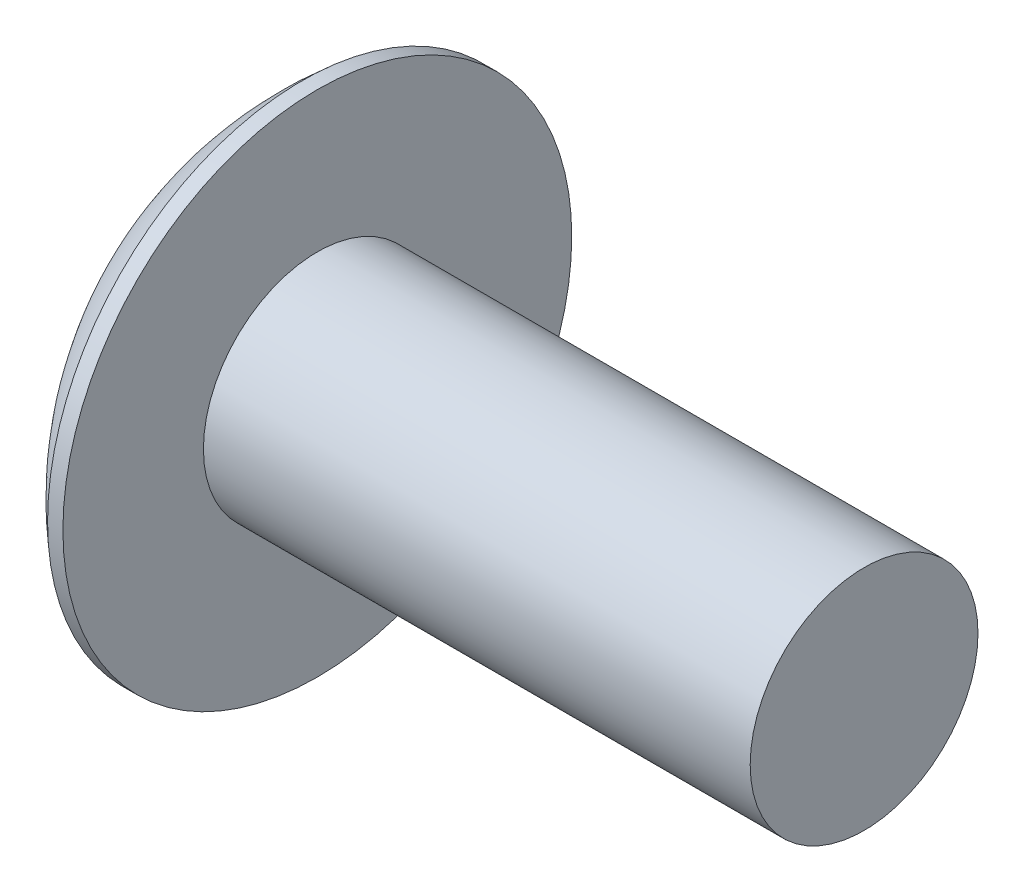
ISO-10303-21;
HEADER;
FILE_DESCRIPTION(('STEP AP214'),'2;1');
FILE_NAME('part.step','',(''),(''),'','','');
FILE_SCHEMA(('AUTOMOTIVE_DESIGN { 1 0 10303 214 1 1 1 1 }'));
ENDSEC;
DATA;
#1=APPLICATION_CONTEXT('core data for automotive mechanical design processes');
#2=APPLICATION_PROTOCOL_DEFINITION('international standard','automotive_design',2000,#1);
#3=PRODUCT_CONTEXT('',#1,'mechanical');
#4=PRODUCT('Part','Part','',(#3));
#5=PRODUCT_RELATED_PRODUCT_CATEGORY('part','',(#4));
#6=PRODUCT_DEFINITION_FORMATION('','',#4);
#7=PRODUCT_DEFINITION_CONTEXT('part definition',#1,'design');
#8=PRODUCT_DEFINITION('design','',#6,#7);
#9=PRODUCT_DEFINITION_SHAPE('','',#8);
#10=(LENGTH_UNIT() NAMED_UNIT(*) SI_UNIT(.MILLI.,.METRE.));
#11=(NAMED_UNIT(*) PLANE_ANGLE_UNIT() SI_UNIT($,.RADIAN.));
#12=(NAMED_UNIT(*) SI_UNIT($,.STERADIAN.) SOLID_ANGLE_UNIT());
#13=UNCERTAINTY_MEASURE_WITH_UNIT(LENGTH_MEASURE(1.E-05),#10,'distance_accuracy_value','');
#14=(GEOMETRIC_REPRESENTATION_CONTEXT(3) GLOBAL_UNCERTAINTY_ASSIGNED_CONTEXT((#13)) GLOBAL_UNIT_ASSIGNED_CONTEXT((#10,
#11,#12)) REPRESENTATION_CONTEXT('',''));
#15=CARTESIAN_POINT('',(0.,0.,0.));
#16=DIRECTION('',(0.,0.,1.));
#17=DIRECTION('',(1.,0.,0.));
#18=AXIS2_PLACEMENT_3D('',#15,#16,#17);
#19=CARTESIAN_POINT('',(11.6078,0.,0.));
#20=DIRECTION('',(-1.,0.,0.));
#21=DIRECTION('',(0.,1.,0.));
#22=AXIS2_PLACEMENT_3D('',#19,#20,#21);
#23=SPHERICAL_SURFACE('',#22,11.6078);
#24=CARTESIAN_POINT('',(4.11380989592327,0.,0.));
#25=DIRECTION('',(-1.,0.,0.));
#26=DIRECTION('',(0.,0.,1.));
#27=AXIS2_PLACEMENT_3D('',#24,#25,#26);
#28=CIRCLE('',#27,8.8646);
#29=CARTESIAN_POINT('',(4.11380989592327,0.,8.8646));
#30=VERTEX_POINT('',#29);
#31=EDGE_CURVE('E152',#30,#30,#28,.T.);
#32=ORIENTED_EDGE('',*,*,#31,.T.);
#33=EDGE_LOOP('',(#32));
#34=FACE_BOUND('',#33,.T.);
#35=CARTESIAN_POINT('',(11.6076636497244,-0.00185599181089486,0.));
#36=DIRECTION('',(-0.0732674626684288,-0.997312327665777,0.));
#37=DIRECTION('',(0.997312327665777,-0.0732674626684288,0.));
#38=AXIS2_PLACEMENT_3D('',#35,#36,#37);
#39=CIRCLE('',#38,11.6077998508203);
#40=CARTESIAN_POINT('',(0.853347013414177,0.788208936514514,4.29668342698341));
#41=VERTEX_POINT('',#40);
#42=CARTESIAN_POINT('',(0.0618747714753645,0.846354375341171,0.846354375341173));
#43=VERTEX_POINT('',#42);
#44=EDGE_CURVE('E180',#41,#43,#39,.T.);
#45=ORIENTED_EDGE('',*,*,#44,.F.);
#46=CARTESIAN_POINT('',(9.60018560309285,0.,-2.56076130067038));
#47=DIRECTION('',(0.616982786851214,0.,0.786976645606024));
#48=DIRECTION('',(0.786976645606024,0.,-0.616982786851214));
#49=AXIS2_PLACEMENT_3D('',#46,#47,#48);
#50=CIRCLE('',#49,11.1423968173064);
#51=CARTESIAN_POINT('',(0.853347013414177,-0.788208936514543,4.2966834269834));
#52=VERTEX_POINT('',#51);
#53=EDGE_CURVE('E148',#41,#52,#50,.T.);
#54=ORIENTED_EDGE('',*,*,#53,.T.);
#55=CARTESIAN_POINT('',(11.6076636497244,0.00185599181089376,0.));
#56=DIRECTION('',(-0.0732674626684286,0.997312327665777,0.));
#57=DIRECTION('',(-0.997312327665777,-0.0732674626684286,0.));
#58=AXIS2_PLACEMENT_3D('',#55,#56,#57);
#59=CIRCLE('',#58,11.6077998508203);
#60=CARTESIAN_POINT('',(0.0618747714753645,-0.846354375341176,0.846354375341173));
#61=VERTEX_POINT('',#60);
#62=EDGE_CURVE('E104',#61,#52,#59,.T.);
#63=ORIENTED_EDGE('',*,*,#62,.F.);
#64=CARTESIAN_POINT('',(11.6076636497244,0.,-0.00185599181089377));
#65=DIRECTION('',(-0.0732674626684286,0.,-0.997312327665777));
#66=DIRECTION('',(-0.997312327665777,0.,0.0732674626684286));
#67=AXIS2_PLACEMENT_3D('',#64,#65,#66);
#68=CIRCLE('',#67,11.6077998508203);
#69=CARTESIAN_POINT('',(0.853347013414175,-4.2966834269834,0.788208936514527));
#70=VERTEX_POINT('',#69);
#71=EDGE_CURVE('E129',#70,#61,#68,.T.);
#72=ORIENTED_EDGE('',*,*,#71,.F.);
#73=CARTESIAN_POINT('',(9.60018560309285,2.56076130067038,0.));
#74=DIRECTION('',(0.616982786851214,-0.786976645606024,0.));
#75=DIRECTION('',(0.786976645606024,0.616982786851214,0.));
#76=AXIS2_PLACEMENT_3D('',#73,#74,#75);
#77=CIRCLE('',#76,11.1423968173064);
#78=CARTESIAN_POINT('',(0.853347013414175,-4.2966834269834,-0.788208936514529));
#79=VERTEX_POINT('',#78);
#80=EDGE_CURVE('E137',#70,#79,#77,.T.);
#81=ORIENTED_EDGE('',*,*,#80,.T.);
#82=CARTESIAN_POINT('',(11.6076636497244,0.,0.00185599181089485));
#83=DIRECTION('',(-0.0732674626684288,0.,0.997312327665777));
#84=DIRECTION('',(0.997312327665777,0.,0.0732674626684288));
#85=AXIS2_PLACEMENT_3D('',#82,#83,#84);
#86=CIRCLE('',#85,11.6077998508203);
#87=CARTESIAN_POINT('',(0.0618747714753645,-0.84635437534117,-0.846354375341174));
#88=VERTEX_POINT('',#87);
#89=EDGE_CURVE('E47',#88,#79,#86,.T.);
#90=ORIENTED_EDGE('',*,*,#89,.F.);
#91=CARTESIAN_POINT('',(0.853347013414177,-0.788208936514512,-4.29668342698341));
#92=VERTEX_POINT('',#91);
#93=EDGE_CURVE('E187',#92,#88,#59,.T.);
#94=ORIENTED_EDGE('',*,*,#93,.F.);
#95=CARTESIAN_POINT('',(9.60018560309285,0.,2.56076130067038));
#96=DIRECTION('',(0.616982786851214,0.,-0.786976645606024));
#97=DIRECTION('',(-0.786976645606024,0.,-0.616982786851214));
#98=AXIS2_PLACEMENT_3D('',#95,#96,#97);
#99=CIRCLE('',#98,11.1423968173064);
#100=CARTESIAN_POINT('',(0.853347013414177,0.788208936514544,-4.2966834269834));
#101=VERTEX_POINT('',#100);
#102=EDGE_CURVE('E130',#92,#101,#99,.T.);
#103=ORIENTED_EDGE('',*,*,#102,.T.);
#104=CARTESIAN_POINT('',(0.0618747714753645,0.846354375341177,-0.846354375341174));
#105=VERTEX_POINT('',#104);
#106=EDGE_CURVE('E175',#105,#101,#39,.T.);
#107=ORIENTED_EDGE('',*,*,#106,.F.);
#108=CARTESIAN_POINT('',(0.853347013414177,4.2966834269834,-0.788208936514529));
#109=VERTEX_POINT('',#108);
#110=EDGE_CURVE('E40',#109,#105,#86,.T.);
#111=ORIENTED_EDGE('',*,*,#110,.F.);
#112=CARTESIAN_POINT('',(9.60018560309285,-2.56076130067038,0.));
#113=DIRECTION('',(0.616982786851214,0.786976645606024,0.));
#114=DIRECTION('',(-0.786976645606024,0.616982786851214,0.));
#115=AXIS2_PLACEMENT_3D('',#112,#113,#114);
#116=CIRCLE('',#115,11.1423968173064);
#117=CARTESIAN_POINT('',(0.853347013414177,4.2966834269834,0.788208936514529));
#118=VERTEX_POINT('',#117);
#119=EDGE_CURVE('E11',#109,#118,#116,.T.);
#120=ORIENTED_EDGE('',*,*,#119,.T.);
#121=EDGE_CURVE('E163',#43,#118,#68,.T.);
#122=ORIENTED_EDGE('',*,*,#121,.F.);
#123=EDGE_LOOP('',(#45,#54,#63,#72,#81,#90,#94,#103,#107,#111,#120,#122));
#124=FACE_BOUND('',#123,.T.);
#125=ADVANCED_FACE('F32',(#34,#124),#23,.T.);
#126=CARTESIAN_POINT('',(6.33387188811189,0.,-0.385582657342657));
#127=DIRECTION('',(-0.0732674626684288,0.,0.997312327665777));
#128=DIRECTION('',(0.997312327665777,0.,0.0732674626684288));
#129=AXIS2_PLACEMENT_3D('',#126,#127,#128);
#130=PLANE('',#129);
#131=ORIENTED_EDGE('',*,*,#110,.T.);
#132=DIRECTION('',(0.994646210240032,-0.0730715965856167,0.0730715965856164));
#133=VECTOR('',#132,1.);
#134=CARTESIAN_POINT('',(6.36189618472155,0.383523854850502,-0.3835238548505));
#135=LINE('',#134,#133);
#136=CARTESIAN_POINT('',(5.7912,0.425450000000001,-0.425449999999998));
#137=VERTEX_POINT('',#136);
#138=EDGE_CURVE('E169',#105,#137,#135,.T.);
#139=ORIENTED_EDGE('',*,*,#138,.T.);
#140=DIRECTION('',(0.785664662091215,-0.615954203284231,0.0577187854825783));
#141=VECTOR('',#140,1.);
#142=CARTESIAN_POINT('',(0.,4.9657,-0.8509));
#143=LINE('',#142,#141);
#144=EDGE_CURVE('E153',#109,#137,#143,.T.);
#145=ORIENTED_EDGE('',*,*,#144,.F.);
#146=EDGE_LOOP('',(#131,#139,#145));
#147=FACE_BOUND('',#146,.T.);
#148=ADVANCED_FACE('F168',(#147),#130,.T.);
#149=DIRECTION('',(0.785664662091215,0.615954203284231,0.0577187854825783));
#150=VECTOR('',#149,1.);
#151=CARTESIAN_POINT('',(0.,-4.9657,-0.8509));
#152=LINE('',#151,#150);
#153=CARTESIAN_POINT('',(5.7912,-0.42545,-0.42545));
#154=VERTEX_POINT('',#153);
#155=EDGE_CURVE('E138',#79,#154,#152,.T.);
#156=ORIENTED_EDGE('',*,*,#155,.T.);
#157=DIRECTION('',(-0.994646210240032,-0.073071596585616,-0.0730715965856164));
#158=VECTOR('',#157,1.);
#159=CARTESIAN_POINT('',(6.36189618472155,-0.383523854850499,-0.3835238548505));
#160=LINE('',#159,#158);
#161=EDGE_CURVE('E190',#154,#88,#160,.T.);
#162=ORIENTED_EDGE('',*,*,#161,.T.);
#163=ORIENTED_EDGE('',*,*,#89,.T.);
#164=EDGE_LOOP('',(#156,#162,#163));
#165=FACE_BOUND('',#164,.T.);
#166=ADVANCED_FACE('F205',(#165),#130,.T.);
#167=CARTESIAN_POINT('',(6.33387188811189,0.,0.385582657342658));
#168=DIRECTION('',(-0.0732674626684286,0.,-0.997312327665777));
#169=DIRECTION('',(-0.997312327665777,0.,0.0732674626684286));
#170=AXIS2_PLACEMENT_3D('',#167,#168,#169);
#171=PLANE('',#170);
#172=DIRECTION('',(0.785664662091215,-0.615954203284231,-0.0577187854825783));
#173=VECTOR('',#172,1.);
#174=CARTESIAN_POINT('',(0.,4.9657,0.8509));
#175=LINE('',#174,#173);
#176=CARTESIAN_POINT('',(5.7912,0.42545,0.42545));
#177=VERTEX_POINT('',#176);
#178=EDGE_CURVE('E206',#118,#177,#175,.T.);
#179=ORIENTED_EDGE('',*,*,#178,.T.);
#180=DIRECTION('',(-0.994646210240032,0.0730715965856162,0.0730715965856162));
#181=VECTOR('',#180,1.);
#182=CARTESIAN_POINT('',(6.36189618472155,0.383523854850499,0.383523854850501));
#183=LINE('',#182,#181);
#184=EDGE_CURVE('E184',#177,#43,#183,.T.);
#185=ORIENTED_EDGE('',*,*,#184,.T.);
#186=ORIENTED_EDGE('',*,*,#121,.T.);
#187=EDGE_LOOP('',(#179,#185,#186));
#188=FACE_BOUND('',#187,.T.);
#189=ADVANCED_FACE('F210',(#188),#171,.T.);
#190=ORIENTED_EDGE('',*,*,#71,.T.);
#191=DIRECTION('',(0.994646210240032,0.0730715965856165,-0.0730715965856162));
#192=VECTOR('',#191,1.);
#193=CARTESIAN_POINT('',(6.36189618472155,-0.383523854850502,0.383523854850501));
#194=LINE('',#193,#192);
#195=CARTESIAN_POINT('',(5.7912,-0.425450000000002,0.425449999999998));
#196=VERTEX_POINT('',#195);
#197=EDGE_CURVE('E102',#61,#196,#194,.T.);
#198=ORIENTED_EDGE('',*,*,#197,.T.);
#199=DIRECTION('',(0.785664662091215,0.615954203284231,-0.0577187854825781));
#200=VECTOR('',#199,1.);
#201=CARTESIAN_POINT('',(0.,-4.9657,0.850899999999998));
#202=LINE('',#201,#200);
#203=EDGE_CURVE('E127',#70,#196,#202,.T.);
#204=ORIENTED_EDGE('',*,*,#203,.F.);
#205=EDGE_LOOP('',(#190,#198,#204));
#206=FACE_BOUND('',#205,.T.);
#207=ADVANCED_FACE('F126',(#206),#171,.T.);
#208=CARTESIAN_POINT('',(-25.4,0.,0.));
#209=DIRECTION('',(-1.,0.,0.));
#210=DIRECTION('',(0.,0.,1.));
#211=AXIS2_PLACEMENT_3D('',#208,#209,#210);
#212=CYLINDRICAL_SURFACE('',#211,3.96875);
#213=CARTESIAN_POINT('',(23.6982,0.,0.));
#214=DIRECTION('',(-1.,0.,0.));
#215=DIRECTION('',(0.,0.,1.));
#216=AXIS2_PLACEMENT_3D('',#213,#214,#215);
#217=CIRCLE('',#216,3.96875);
#218=CARTESIAN_POINT('',(23.6982,0.,3.96875));
#219=VERTEX_POINT('',#218);
#220=EDGE_CURVE('E149',#219,#219,#217,.T.);
#221=ORIENTED_EDGE('',*,*,#220,.T.);
#222=EDGE_LOOP('',(#221));
#223=FACE_BOUND('',#222,.T.);
#224=CARTESIAN_POINT('',(4.6482,0.,0.));
#225=DIRECTION('',(-1.,0.,0.));
#226=DIRECTION('',(0.,0.,1.));
#227=AXIS2_PLACEMENT_3D('',#224,#225,#226);
#228=CIRCLE('',#227,3.96875);
#229=CARTESIAN_POINT('',(4.6482,0.,3.96875));
#230=VERTEX_POINT('',#229);
#231=EDGE_CURVE('E159',#230,#230,#228,.T.);
#232=ORIENTED_EDGE('',*,*,#231,.F.);
#233=EDGE_LOOP('',(#232));
#234=FACE_BOUND('',#233,.T.);
#235=ADVANCED_FACE('F34',(#223,#234),#212,.T.);
#236=CARTESIAN_POINT('',(4.6482,3.96875,0.));
#237=DIRECTION('',(-1.,0.,0.));
#238=DIRECTION('',(0.,0.,1.));
#239=AXIS2_PLACEMENT_3D('',#236,#237,#238);
#240=PLANE('',#239);
#241=CARTESIAN_POINT('',(4.6482,0.,0.));
#242=DIRECTION('',(-1.,0.,0.));
#243=DIRECTION('',(0.,0.,1.));
#244=AXIS2_PLACEMENT_3D('',#241,#242,#243);
#245=CIRCLE('',#244,8.8646);
#246=CARTESIAN_POINT('',(4.6482,0.,8.8646));
#247=VERTEX_POINT('',#246);
#248=EDGE_CURVE('E156',#247,#247,#245,.T.);
#249=ORIENTED_EDGE('',*,*,#248,.F.);
#250=EDGE_LOOP('',(#249));
#251=FACE_BOUND('',#250,.T.);
#252=ORIENTED_EDGE('',*,*,#231,.T.);
#253=EDGE_LOOP('',(#252));
#254=FACE_BOUND('',#253,.T.);
#255=ADVANCED_FACE('F234',(#251,#254),#240,.F.);
#256=CARTESIAN_POINT('',(-25.4,0.,0.));
#257=DIRECTION('',(-1.,0.,0.));
#258=DIRECTION('',(0.,0.,1.));
#259=AXIS2_PLACEMENT_3D('',#256,#257,#258);
#260=CYLINDRICAL_SURFACE('',#259,8.8646);
#261=ORIENTED_EDGE('',*,*,#248,.T.);
#262=EDGE_LOOP('',(#261));
#263=FACE_BOUND('',#262,.T.);
#264=ORIENTED_EDGE('',*,*,#31,.F.);
#265=EDGE_LOOP('',(#264));
#266=FACE_BOUND('',#265,.T.);
#267=ADVANCED_FACE('F232',(#263,#266),#260,.T.);
#268=CARTESIAN_POINT('',(23.6982,3.96875,0.));
#269=DIRECTION('',(1.,0.,0.));
#270=DIRECTION('',(0.,0.,-1.));
#271=AXIS2_PLACEMENT_3D('',#268,#269,#270);
#272=PLANE('',#271);
#273=ORIENTED_EDGE('',*,*,#220,.F.);
#274=EDGE_LOOP('',(#273));
#275=FACE_BOUND('',#274,.T.);
#276=ADVANCED_FACE('F230',(#275),#272,.T.);
#277=CARTESIAN_POINT('',(0.,4.9657,0.8509));
#278=DIRECTION('',(0.616982786851214,0.786976645606024,0.));
#279=DIRECTION('',(-0.786976645606024,0.616982786851214,0.));
#280=AXIS2_PLACEMENT_3D('',#277,#278,#279);
#281=PLANE('',#280);
#282=ORIENTED_EDGE('',*,*,#144,.T.);
#283=DIRECTION('',(0.,0.,-1.));
#284=VECTOR('',#283,1.);
#285=CARTESIAN_POINT('',(5.7912,0.42545,0.42545));
#286=LINE('',#285,#284);
#287=EDGE_CURVE('E120',#177,#137,#286,.T.);
#288=ORIENTED_EDGE('',*,*,#287,.F.);
#289=ORIENTED_EDGE('',*,*,#178,.F.);
#290=ORIENTED_EDGE('',*,*,#119,.F.);
#291=EDGE_LOOP('',(#282,#288,#289,#290));
#292=FACE_BOUND('',#291,.T.);
#293=ADVANCED_FACE('F209',(#292),#281,.F.);
#294=CARTESIAN_POINT('',(5.7912,-0.42545,-0.42545));
#295=DIRECTION('',(0.616982786851214,-0.786976645606024,0.));
#296=DIRECTION('',(0.786976645606024,0.616982786851214,0.));
#297=AXIS2_PLACEMENT_3D('',#294,#295,#296);
#298=PLANE('',#297);
#299=ORIENTED_EDGE('',*,*,#203,.T.);
#300=DIRECTION('',(0.,0.,1.));
#301=VECTOR('',#300,1.);
#302=CARTESIAN_POINT('',(5.7912,-0.42545,-0.42545));
#303=LINE('',#302,#301);
#304=EDGE_CURVE('E119',#154,#196,#303,.T.);
#305=ORIENTED_EDGE('',*,*,#304,.F.);
#306=ORIENTED_EDGE('',*,*,#155,.F.);
#307=ORIENTED_EDGE('',*,*,#80,.F.);
#308=EDGE_LOOP('',(#299,#305,#306,#307));
#309=FACE_BOUND('',#308,.T.);
#310=ADVANCED_FACE('F134',(#309),#298,.F.);
#311=CARTESIAN_POINT('',(5.7912,0.42545,-0.42545));
#312=DIRECTION('',(-1.,0.,0.));
#313=DIRECTION('',(0.,0.,1.));
#314=AXIS2_PLACEMENT_3D('',#311,#312,#313);
#315=PLANE('',#314);
#316=DIRECTION('',(0.,1.,0.));
#317=VECTOR('',#316,1.);
#318=CARTESIAN_POINT('',(5.7912,-0.42545,-0.42545));
#319=LINE('',#318,#317);
#320=EDGE_CURVE('E142',#154,#137,#319,.T.);
#321=ORIENTED_EDGE('',*,*,#320,.F.);
#322=ORIENTED_EDGE('',*,*,#304,.T.);
#323=DIRECTION('',(0.,-1.,0.));
#324=VECTOR('',#323,1.);
#325=CARTESIAN_POINT('',(5.7912,0.42545,0.42545));
#326=LINE('',#325,#324);
#327=EDGE_CURVE('E111',#177,#196,#326,.T.);
#328=ORIENTED_EDGE('',*,*,#327,.F.);
#329=ORIENTED_EDGE('',*,*,#287,.T.);
#330=EDGE_LOOP('',(#321,#322,#328,#329));
#331=FACE_BOUND('',#330,.T.);
#332=ADVANCED_FACE('F140',(#331),#315,.T.);
#333=CARTESIAN_POINT('',(5.7912,0.425450000000001,-0.425449999999998));
#334=DIRECTION('',(0.616982786851214,0.,-0.786976645606024));
#335=DIRECTION('',(0.786976645606024,0.,0.616982786851214));
#336=AXIS2_PLACEMENT_3D('',#333,#334,#335);
#337=PLANE('',#336);
#338=DIRECTION('',(0.785664662091215,0.057718785482576,0.615954203284232));
#339=VECTOR('',#338,1.);
#340=CARTESIAN_POINT('',(0.,-0.850899999999981,-4.9657));
#341=LINE('',#340,#339);
#342=EDGE_CURVE('E195',#92,#154,#341,.T.);
#343=ORIENTED_EDGE('',*,*,#342,.T.);
#344=ORIENTED_EDGE('',*,*,#320,.T.);
#345=DIRECTION('',(0.785664662091215,-0.0577187854825805,0.615954203284231));
#346=VECTOR('',#345,1.);
#347=CARTESIAN_POINT('',(0.,0.850900000000017,-4.9657));
#348=LINE('',#347,#346);
#349=EDGE_CURVE('E108',#101,#137,#348,.T.);
#350=ORIENTED_EDGE('',*,*,#349,.F.);
#351=ORIENTED_EDGE('',*,*,#102,.F.);
#352=EDGE_LOOP('',(#343,#344,#350,#351));
#353=FACE_BOUND('',#352,.T.);
#354=ADVANCED_FACE('F200',(#353),#337,.F.);
#355=CARTESIAN_POINT('',(6.33387188811189,-0.385582657342658,0.));
#356=DIRECTION('',(-0.0732674626684286,0.997312327665777,0.));
#357=DIRECTION('',(-0.997312327665777,-0.0732674626684286,0.));
#358=AXIS2_PLACEMENT_3D('',#355,#356,#357);
#359=PLANE('',#358);
#360=ORIENTED_EDGE('',*,*,#93,.T.);
#361=ORIENTED_EDGE('',*,*,#161,.F.);
#362=ORIENTED_EDGE('',*,*,#342,.F.);
#363=EDGE_LOOP('',(#360,#361,#362));
#364=FACE_BOUND('',#363,.T.);
#365=ADVANCED_FACE('F204',(#364),#359,.T.);
#366=CARTESIAN_POINT('',(6.33387188811189,0.385582657342657,0.));
#367=DIRECTION('',(-0.0732674626684288,-0.997312327665777,0.));
#368=DIRECTION('',(0.997312327665777,-0.0732674626684288,0.));
#369=AXIS2_PLACEMENT_3D('',#366,#367,#368);
#370=PLANE('',#369);
#371=ORIENTED_EDGE('',*,*,#106,.T.);
#372=ORIENTED_EDGE('',*,*,#349,.T.);
#373=ORIENTED_EDGE('',*,*,#138,.F.);
#374=EDGE_LOOP('',(#371,#372,#373));
#375=FACE_BOUND('',#374,.T.);
#376=ADVANCED_FACE('F198',(#375),#370,.T.);
#377=CARTESIAN_POINT('',(0.,-0.850900000000017,4.9657));
#378=DIRECTION('',(0.616982786851214,0.,0.786976645606024));
#379=DIRECTION('',(-0.786976645606024,0.,0.616982786851214));
#380=AXIS2_PLACEMENT_3D('',#377,#378,#379);
#381=PLANE('',#380);
#382=DIRECTION('',(0.785664662091215,-0.0577187854825762,-0.615954203284232));
#383=VECTOR('',#382,1.);
#384=CARTESIAN_POINT('',(0.,0.850899999999983,4.9657));
#385=LINE('',#384,#383);
#386=EDGE_CURVE('E107',#41,#177,#385,.T.);
#387=ORIENTED_EDGE('',*,*,#386,.T.);
#388=ORIENTED_EDGE('',*,*,#327,.T.);
#389=DIRECTION('',(0.785664662091215,0.0577187854825804,-0.615954203284231));
#390=VECTOR('',#389,1.);
#391=CARTESIAN_POINT('',(0.,-0.850900000000017,4.9657));
#392=LINE('',#391,#390);
#393=EDGE_CURVE('E98',#52,#196,#392,.T.);
#394=ORIENTED_EDGE('',*,*,#393,.F.);
#395=ORIENTED_EDGE('',*,*,#53,.F.);
#396=EDGE_LOOP('',(#387,#388,#394,#395));
#397=FACE_BOUND('',#396,.T.);
#398=ADVANCED_FACE('F112',(#397),#381,.F.);
#399=ORIENTED_EDGE('',*,*,#44,.T.);
#400=ORIENTED_EDGE('',*,*,#184,.F.);
#401=ORIENTED_EDGE('',*,*,#386,.F.);
#402=EDGE_LOOP('',(#399,#400,#401));
#403=FACE_BOUND('',#402,.T.);
#404=ADVANCED_FACE('F211',(#403),#370,.T.);
#405=ORIENTED_EDGE('',*,*,#62,.T.);
#406=ORIENTED_EDGE('',*,*,#393,.T.);
#407=ORIENTED_EDGE('',*,*,#197,.F.);
#408=EDGE_LOOP('',(#405,#406,#407));
#409=FACE_BOUND('',#408,.T.);
#410=ADVANCED_FACE('F100',(#409),#359,.T.);
#411=CLOSED_SHELL('',(#125,#148,#166,#189,#207,#235,#255,#267,#276,#293,#310,#332,#354,#365,
#376,#398,#404,#410));
#412=MANIFOLD_SOLID_BREP('B2',#411);
#413=ADVANCED_BREP_SHAPE_REPRESENTATION('',(#18,#412),#14);
#414=SHAPE_DEFINITION_REPRESENTATION(#9,#413);
ENDSEC;
END-ISO-10303-21;
